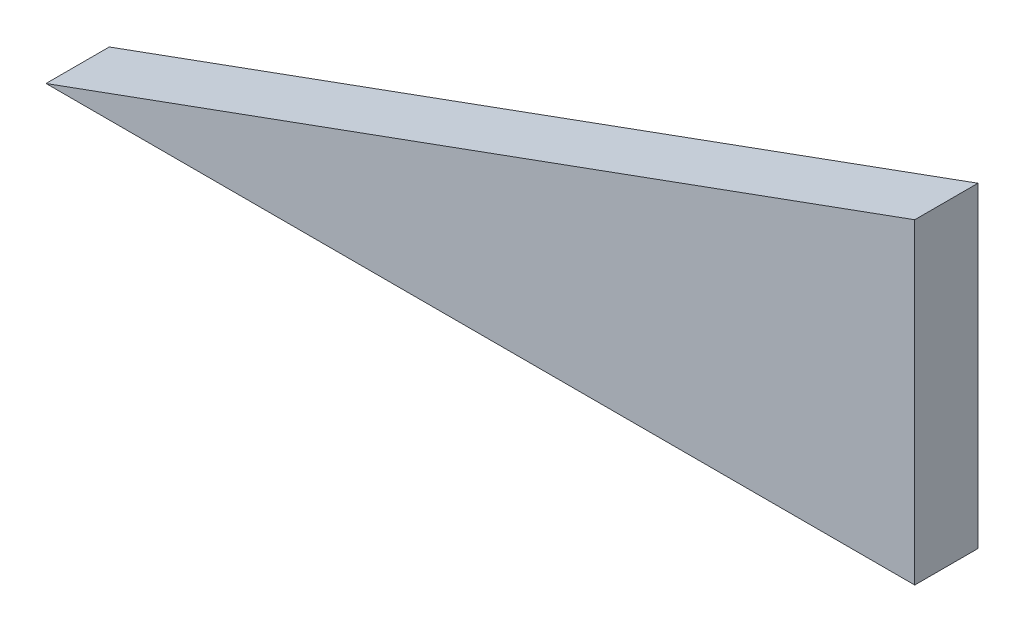
ISO-10303-21;
HEADER;
FILE_DESCRIPTION(('STEP AP214'),'2;1');
FILE_NAME('part.step','',(''),(''),'','','');
FILE_SCHEMA(('AUTOMOTIVE_DESIGN { 1 0 10303 214 1 1 1 1 }'));
ENDSEC;
DATA;
#1=APPLICATION_CONTEXT('core data for automotive mechanical design processes');
#2=APPLICATION_PROTOCOL_DEFINITION('international standard','automotive_design',2000,#1);
#3=PRODUCT_CONTEXT('',#1,'mechanical');
#4=PRODUCT('Part','Part','',(#3));
#5=PRODUCT_RELATED_PRODUCT_CATEGORY('part','',(#4));
#6=PRODUCT_DEFINITION_FORMATION('','',#4);
#7=PRODUCT_DEFINITION_CONTEXT('part definition',#1,'design');
#8=PRODUCT_DEFINITION('design','',#6,#7);
#9=PRODUCT_DEFINITION_SHAPE('','',#8);
#10=(LENGTH_UNIT() NAMED_UNIT(*) SI_UNIT(.MILLI.,.METRE.));
#11=(NAMED_UNIT(*) PLANE_ANGLE_UNIT() SI_UNIT($,.RADIAN.));
#12=(NAMED_UNIT(*) SI_UNIT($,.STERADIAN.) SOLID_ANGLE_UNIT());
#13=UNCERTAINTY_MEASURE_WITH_UNIT(LENGTH_MEASURE(1.E-05),#10,'distance_accuracy_value','');
#14=(GEOMETRIC_REPRESENTATION_CONTEXT(3) GLOBAL_UNCERTAINTY_ASSIGNED_CONTEXT((#13)) GLOBAL_UNIT_ASSIGNED_CONTEXT((#10,
#11,#12)) REPRESENTATION_CONTEXT('',''));
#15=CARTESIAN_POINT('',(0.,0.,0.));
#16=DIRECTION('',(0.,0.,1.));
#17=DIRECTION('',(1.,0.,0.));
#18=AXIS2_PLACEMENT_3D('',#15,#16,#17);
#19=CARTESIAN_POINT('',(0.,0.,30.));
#20=DIRECTION('',(-1.,0.,0.));
#21=DIRECTION('',(0.,-1.,0.));
#22=AXIS2_PLACEMENT_3D('',#19,#20,#21);
#23=PLANE('',#22);
#24=DIRECTION('',(0.,1.,0.));
#25=VECTOR('',#24,1.);
#26=CARTESIAN_POINT('',(0.,0.,0.));
#27=LINE('',#26,#25);
#28=CARTESIAN_POINT('',(0.,0.,0.));
#29=VERTEX_POINT('',#28);
#30=CARTESIAN_POINT('',(0.,150.03717516368,0.));
#31=VERTEX_POINT('',#30);
#32=EDGE_CURVE('E89',#29,#31,#27,.T.);
#33=ORIENTED_EDGE('',*,*,#32,.T.);
#34=DIRECTION('',(0.,0.,-1.));
#35=VECTOR('',#34,1.);
#36=CARTESIAN_POINT('',(0.,150.03717516368,30.));
#37=LINE('',#36,#35);
#38=CARTESIAN_POINT('',(0.,150.03717516368,30.));
#39=VERTEX_POINT('',#38);
#40=EDGE_CURVE('E11',#39,#31,#37,.T.);
#41=ORIENTED_EDGE('',*,*,#40,.F.);
#42=DIRECTION('',(0.,1.,0.));
#43=VECTOR('',#42,1.);
#44=CARTESIAN_POINT('',(0.,0.,30.));
#45=LINE('',#44,#43);
#46=CARTESIAN_POINT('',(0.,0.,30.));
#47=VERTEX_POINT('',#46);
#48=EDGE_CURVE('E81',#47,#39,#45,.T.);
#49=ORIENTED_EDGE('',*,*,#48,.F.);
#50=DIRECTION('',(0.,0.,-1.));
#51=VECTOR('',#50,1.);
#52=CARTESIAN_POINT('',(0.,0.,30.));
#53=LINE('',#52,#51);
#54=EDGE_CURVE('E90',#47,#29,#53,.T.);
#55=ORIENTED_EDGE('',*,*,#54,.T.);
#56=EDGE_LOOP('',(#33,#41,#49,#55));
#57=FACE_BOUND('',#56,.T.);
#58=ADVANCED_FACE('F39',(#57),#23,.F.);
#59=CARTESIAN_POINT('',(0.,150.03717516368,30.));
#60=DIRECTION('',(0.342184145417466,-0.939632912697782,0.));
#61=DIRECTION('',(0.939632912697782,0.342184145417466,0.));
#62=AXIS2_PLACEMENT_3D('',#59,#60,#61);
#63=PLANE('',#62);
#64=DIRECTION('',(-0.939632912697782,-0.342184145417466,0.));
#65=VECTOR('',#64,1.);
#66=CARTESIAN_POINT('',(0.,150.03717516368,0.));
#67=LINE('',#66,#65);
#68=CARTESIAN_POINT('',(-412.,0.,0.));
#69=VERTEX_POINT('',#68);
#70=EDGE_CURVE('E68',#31,#69,#67,.T.);
#71=ORIENTED_EDGE('',*,*,#70,.T.);
#72=DIRECTION('',(0.,0.,-1.));
#73=VECTOR('',#72,1.);
#74=CARTESIAN_POINT('',(-412.,0.,30.));
#75=LINE('',#74,#73);
#76=CARTESIAN_POINT('',(-412.,0.,30.));
#77=VERTEX_POINT('',#76);
#78=EDGE_CURVE('E48',#77,#69,#75,.T.);
#79=ORIENTED_EDGE('',*,*,#78,.F.);
#80=DIRECTION('',(-0.939632912697782,-0.342184145417466,0.));
#81=VECTOR('',#80,1.);
#82=CARTESIAN_POINT('',(0.,150.03717516368,30.));
#83=LINE('',#82,#81);
#84=EDGE_CURVE('E76',#39,#77,#83,.T.);
#85=ORIENTED_EDGE('',*,*,#84,.F.);
#86=ORIENTED_EDGE('',*,*,#40,.T.);
#87=EDGE_LOOP('',(#71,#79,#85,#86));
#88=FACE_BOUND('',#87,.T.);
#89=ADVANCED_FACE('F77',(#88),#63,.F.);
#90=CARTESIAN_POINT('',(0.,0.,30.));
#91=DIRECTION('',(0.,1.,0.));
#92=DIRECTION('',(-1.,0.,0.));
#93=AXIS2_PLACEMENT_3D('',#90,#91,#92);
#94=PLANE('',#93);
#95=DIRECTION('',(1.,0.,0.));
#96=VECTOR('',#95,1.);
#97=CARTESIAN_POINT('',(0.,0.,0.));
#98=LINE('',#97,#96);
#99=EDGE_CURVE('E73',#69,#29,#98,.T.);
#100=ORIENTED_EDGE('',*,*,#99,.T.);
#101=ORIENTED_EDGE('',*,*,#54,.F.);
#102=DIRECTION('',(1.,0.,0.));
#103=VECTOR('',#102,1.);
#104=CARTESIAN_POINT('',(0.,0.,30.));
#105=LINE('',#104,#103);
#106=EDGE_CURVE('E56',#77,#47,#105,.T.);
#107=ORIENTED_EDGE('',*,*,#106,.F.);
#108=ORIENTED_EDGE('',*,*,#78,.T.);
#109=EDGE_LOOP('',(#100,#101,#107,#108));
#110=FACE_BOUND('',#109,.T.);
#111=ADVANCED_FACE('F102',(#110),#94,.F.);
#112=CARTESIAN_POINT('',(0.,0.,30.));
#113=DIRECTION('',(0.,0.,1.));
#114=DIRECTION('',(1.,0.,0.));
#115=AXIS2_PLACEMENT_3D('',#112,#113,#114);
#116=PLANE('',#115);
#117=ORIENTED_EDGE('',*,*,#48,.T.);
#118=ORIENTED_EDGE('',*,*,#84,.T.);
#119=ORIENTED_EDGE('',*,*,#106,.T.);
#120=EDGE_LOOP('',(#117,#118,#119));
#121=FACE_BOUND('',#120,.T.);
#122=ADVANCED_FACE('F84',(#121),#116,.T.);
#123=CARTESIAN_POINT('',(0.,0.,0.));
#124=DIRECTION('',(0.,0.,1.));
#125=DIRECTION('',(1.,0.,0.));
#126=AXIS2_PLACEMENT_3D('',#123,#124,#125);
#127=PLANE('',#126);
#128=ORIENTED_EDGE('',*,*,#32,.F.);
#129=ORIENTED_EDGE('',*,*,#99,.F.);
#130=ORIENTED_EDGE('',*,*,#70,.F.);
#131=EDGE_LOOP('',(#128,#129,#130));
#132=FACE_BOUND('',#131,.T.);
#133=ADVANCED_FACE('F103',(#132),#127,.F.);
#134=CLOSED_SHELL('',(#58,#89,#111,#122,#133));
#135=MANIFOLD_SOLID_BREP('B2',#134);
#136=ADVANCED_BREP_SHAPE_REPRESENTATION('',(#18,#135),#14);
#137=SHAPE_DEFINITION_REPRESENTATION(#9,#136);
ENDSEC;
END-ISO-10303-21;
